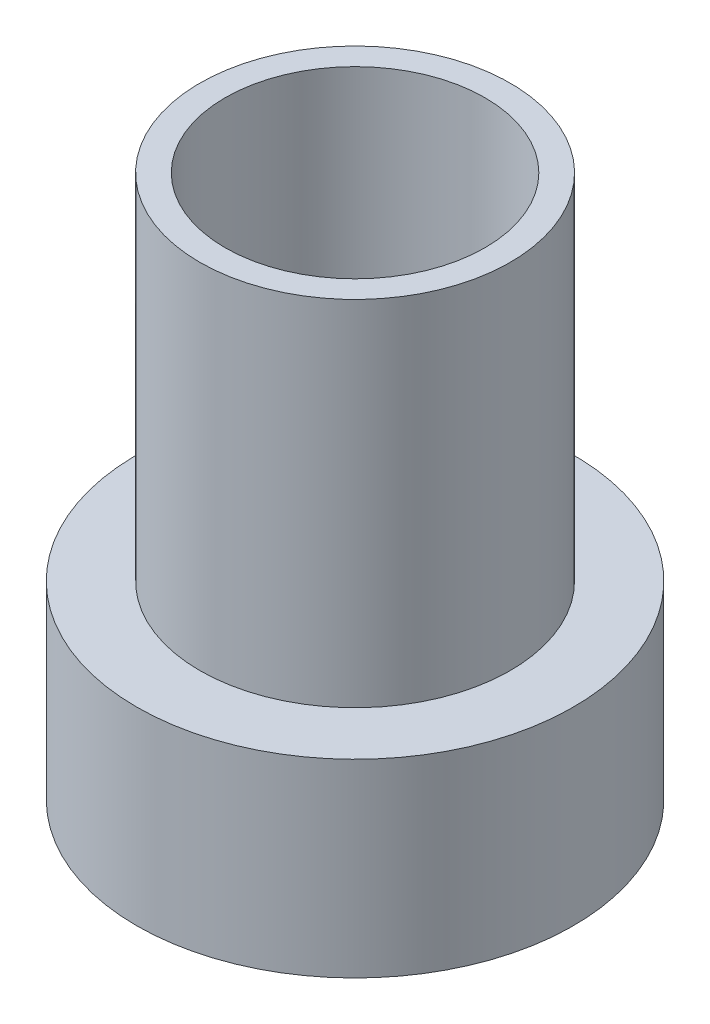
ISO-10303-21;
HEADER;
FILE_DESCRIPTION(('STEP AP214'),'2;1');
FILE_NAME('part.step','',(''),(''),'','','');
FILE_SCHEMA(('AUTOMOTIVE_DESIGN { 1 0 10303 214 1 1 1 1 }'));
ENDSEC;
DATA;
#1=APPLICATION_CONTEXT('core data for automotive mechanical design processes');
#2=APPLICATION_PROTOCOL_DEFINITION('international standard','automotive_design',2000,#1);
#3=PRODUCT_CONTEXT('',#1,'mechanical');
#4=PRODUCT('Part','Part','',(#3));
#5=PRODUCT_RELATED_PRODUCT_CATEGORY('part','',(#4));
#6=PRODUCT_DEFINITION_FORMATION('','',#4);
#7=PRODUCT_DEFINITION_CONTEXT('part definition',#1,'design');
#8=PRODUCT_DEFINITION('design','',#6,#7);
#9=PRODUCT_DEFINITION_SHAPE('','',#8);
#10=(LENGTH_UNIT() NAMED_UNIT(*) SI_UNIT(.MILLI.,.METRE.));
#11=(NAMED_UNIT(*) PLANE_ANGLE_UNIT() SI_UNIT($,.RADIAN.));
#12=(NAMED_UNIT(*) SI_UNIT($,.STERADIAN.) SOLID_ANGLE_UNIT());
#13=UNCERTAINTY_MEASURE_WITH_UNIT(LENGTH_MEASURE(1.E-05),#10,'distance_accuracy_value','');
#14=(GEOMETRIC_REPRESENTATION_CONTEXT(3) GLOBAL_UNCERTAINTY_ASSIGNED_CONTEXT((#13)) GLOBAL_UNIT_ASSIGNED_CONTEXT((#10,
#11,#12)) REPRESENTATION_CONTEXT('',''));
#15=CARTESIAN_POINT('',(0.,0.,0.));
#16=DIRECTION('',(0.,0.,1.));
#17=DIRECTION('',(1.,0.,0.));
#18=AXIS2_PLACEMENT_3D('',#15,#16,#17);
#19=CARTESIAN_POINT('',(0.,3.6,0.));
#20=DIRECTION('',(0.,-1.,0.));
#21=DIRECTION('',(0.,0.,-1.));
#22=AXIS2_PLACEMENT_3D('',#19,#20,#21);
#23=CYLINDRICAL_SURFACE('',#22,4.15);
#24=CARTESIAN_POINT('',(0.,3.6,0.));
#25=DIRECTION('',(0.,1.,0.));
#26=DIRECTION('',(0.,0.,1.));
#27=AXIS2_PLACEMENT_3D('',#24,#25,#26);
#28=CIRCLE('',#27,4.15);
#29=CARTESIAN_POINT('',(0.,3.6,4.15));
#30=VERTEX_POINT('',#29);
#31=EDGE_CURVE('E51',#30,#30,#28,.T.);
#32=ORIENTED_EDGE('',*,*,#31,.F.);
#33=EDGE_LOOP('',(#32));
#34=FACE_BOUND('',#33,.T.);
#35=CARTESIAN_POINT('',(0.,0.,0.));
#36=DIRECTION('',(0.,1.,0.));
#37=DIRECTION('',(0.,0.,1.));
#38=AXIS2_PLACEMENT_3D('',#35,#36,#37);
#39=CIRCLE('',#38,4.15);
#40=CARTESIAN_POINT('',(0.,0.,4.15));
#41=VERTEX_POINT('',#40);
#42=EDGE_CURVE('E58',#41,#41,#39,.T.);
#43=ORIENTED_EDGE('',*,*,#42,.T.);
#44=EDGE_LOOP('',(#43));
#45=FACE_BOUND('',#44,.T.);
#46=ADVANCED_FACE('F39',(#34,#45),#23,.T.);
#47=CARTESIAN_POINT('',(0.,3.6,0.));
#48=DIRECTION('',(0.,1.,0.));
#49=DIRECTION('',(0.,0.,1.));
#50=AXIS2_PLACEMENT_3D('',#47,#48,#49);
#51=PLANE('',#50);
#52=CARTESIAN_POINT('',(0.,3.6,0.));
#53=DIRECTION('',(0.,1.,0.));
#54=DIRECTION('',(0.,0.,1.));
#55=AXIS2_PLACEMENT_3D('',#52,#53,#54);
#56=CIRCLE('',#55,2.95);
#57=CARTESIAN_POINT('',(0.,3.6,2.95));
#58=VERTEX_POINT('',#57);
#59=EDGE_CURVE('E55',#58,#58,#56,.T.);
#60=ORIENTED_EDGE('',*,*,#59,.F.);
#61=EDGE_LOOP('',(#60));
#62=FACE_BOUND('',#61,.T.);
#63=ORIENTED_EDGE('',*,*,#31,.T.);
#64=EDGE_LOOP('',(#63));
#65=FACE_BOUND('',#64,.T.);
#66=ADVANCED_FACE('F89',(#62,#65),#51,.T.);
#67=CARTESIAN_POINT('',(0.,0.,0.));
#68=DIRECTION('',(0.,1.,0.));
#69=DIRECTION('',(0.,0.,1.));
#70=AXIS2_PLACEMENT_3D('',#67,#68,#69);
#71=PLANE('',#70);
#72=CARTESIAN_POINT('',(0.,0.,0.));
#73=DIRECTION('',(0.,1.,0.));
#74=DIRECTION('',(0.,0.,1.));
#75=AXIS2_PLACEMENT_3D('',#72,#73,#74);
#76=CIRCLE('',#75,3.78871958767989);
#77=CARTESIAN_POINT('',(0.,0.,-3.78871958767989));
#78=VERTEX_POINT('',#77);
#79=EDGE_CURVE('E47',#78,#78,#76,.T.);
#80=ORIENTED_EDGE('',*,*,#79,.T.);
#81=EDGE_LOOP('',(#80));
#82=FACE_BOUND('',#81,.T.);
#83=ORIENTED_EDGE('',*,*,#42,.F.);
#84=EDGE_LOOP('',(#83));
#85=FACE_BOUND('',#84,.T.);
#86=ADVANCED_FACE('F86',(#82,#85),#71,.F.);
#87=CARTESIAN_POINT('',(0.,10.32,0.));
#88=DIRECTION('',(0.,-1.,0.));
#89=DIRECTION('',(0.,0.,-1.));
#90=AXIS2_PLACEMENT_3D('',#87,#88,#89);
#91=CYLINDRICAL_SURFACE('',#90,2.47);
#92=CARTESIAN_POINT('',(0.,1.75000000000001,0.));
#93=DIRECTION('',(0.,1.,0.));
#94=DIRECTION('',(0.,0.,1.));
#95=AXIS2_PLACEMENT_3D('',#92,#93,#94);
#96=CIRCLE('',#95,2.47);
#97=CARTESIAN_POINT('',(0.,1.75000000000001,-2.47));
#98=VERTEX_POINT('',#97);
#99=EDGE_CURVE('E10',#98,#98,#96,.F.);
#100=ORIENTED_EDGE('',*,*,#99,.T.);
#101=EDGE_LOOP('',(#100));
#102=FACE_BOUND('',#101,.T.);
#103=CARTESIAN_POINT('',(0.,10.32,0.));
#104=DIRECTION('',(0.,1.,0.));
#105=DIRECTION('',(0.,0.,1.));
#106=AXIS2_PLACEMENT_3D('',#103,#104,#105);
#107=CIRCLE('',#106,2.47);
#108=CARTESIAN_POINT('',(0.,10.32,2.47));
#109=VERTEX_POINT('',#108);
#110=EDGE_CURVE('E66',#109,#109,#107,.T.);
#111=ORIENTED_EDGE('',*,*,#110,.T.);
#112=EDGE_LOOP('',(#111));
#113=FACE_BOUND('',#112,.T.);
#114=ADVANCED_FACE('F70',(#102,#113),#91,.F.);
#115=CARTESIAN_POINT('',(0.,10.32,0.));
#116=DIRECTION('',(0.,-1.,0.));
#117=DIRECTION('',(0.,0.,-1.));
#118=AXIS2_PLACEMENT_3D('',#115,#116,#117);
#119=CYLINDRICAL_SURFACE('',#118,2.95);
#120=ORIENTED_EDGE('',*,*,#59,.T.);
#121=EDGE_LOOP('',(#120));
#122=FACE_BOUND('',#121,.T.);
#123=CARTESIAN_POINT('',(0.,10.32,0.));
#124=DIRECTION('',(0.,1.,0.));
#125=DIRECTION('',(0.,0.,1.));
#126=AXIS2_PLACEMENT_3D('',#123,#124,#125);
#127=CIRCLE('',#126,2.95);
#128=CARTESIAN_POINT('',(0.,10.32,2.95));
#129=VERTEX_POINT('',#128);
#130=EDGE_CURVE('E60',#129,#129,#127,.T.);
#131=ORIENTED_EDGE('',*,*,#130,.F.);
#132=EDGE_LOOP('',(#131));
#133=FACE_BOUND('',#132,.T.);
#134=ADVANCED_FACE('F75',(#122,#133),#119,.T.);
#135=CARTESIAN_POINT('',(0.,10.32,0.));
#136=DIRECTION('',(0.,1.,0.));
#137=DIRECTION('',(0.,0.,1.));
#138=AXIS2_PLACEMENT_3D('',#135,#136,#137);
#139=PLANE('',#138);
#140=ORIENTED_EDGE('',*,*,#110,.F.);
#141=EDGE_LOOP('',(#140));
#142=FACE_BOUND('',#141,.T.);
#143=ORIENTED_EDGE('',*,*,#130,.T.);
#144=EDGE_LOOP('',(#143));
#145=FACE_BOUND('',#144,.T.);
#146=ADVANCED_FACE('F72',(#142,#145),#139,.T.);
#147=CARTESIAN_POINT('',(0.,0.,0.));
#148=DIRECTION('',(0.,-1.,0.));
#149=DIRECTION('',(0.,0.,-1.));
#150=AXIS2_PLACEMENT_3D('',#147,#148,#149);
#151=CONICAL_SURFACE('',#150,3.78871958767989,0.6457718232379);
#152=CARTESIAN_POINT('',(0.,1.75000000000001,-2.47));
#153=CARTESIAN_POINT('',(0.,1.73177083333334,-2.48373666237167));
#154=CARTESIAN_POINT('',(0.,1.71354166666667,-2.49747332474333));
#155=CARTESIAN_POINT('',(0.,1.67708333333334,-2.52494664948666));
#156=CARTESIAN_POINT('',(0.,1.65885416666667,-2.53868331185833));
#157=CARTESIAN_POINT('',(0.,1.62239583333334,-2.56615663660166));
#158=CARTESIAN_POINT('',(0.,1.60416666666667,-2.57989329897332));
#159=CARTESIAN_POINT('',(0.,1.56770833333334,-2.60736662371666));
#160=CARTESIAN_POINT('',(0.,1.54947916666667,-2.62110328608832));
#161=CARTESIAN_POINT('',(0.,1.51302083333334,-2.64857661083165));
#162=CARTESIAN_POINT('',(0.,1.49479166666667,-2.66231327320332));
#163=CARTESIAN_POINT('',(0.,1.45833333333334,-2.68978659794665));
#164=CARTESIAN_POINT('',(0.,1.44010416666667,-2.70352326031831));
#165=CARTESIAN_POINT('',(0.,1.40364583333334,-2.73099658506165));
#166=CARTESIAN_POINT('',(0.,1.38541666666667,-2.74473324743331));
#167=CARTESIAN_POINT('',(0.,1.34895833333334,-2.77220657217664));
#168=CARTESIAN_POINT('',(0.,1.33072916666667,-2.78594323454831));
#169=CARTESIAN_POINT('',(0.,1.29427083333334,-2.81341655929164));
#170=CARTESIAN_POINT('',(0.,1.27604166666667,-2.8271532216633));
#171=CARTESIAN_POINT('',(0.,1.23958333333334,-2.85462654640664));
#172=CARTESIAN_POINT('',(0.,1.22135416666667,-2.8683632087783));
#173=CARTESIAN_POINT('',(0.,1.18489583333334,-2.89583653352163));
#174=CARTESIAN_POINT('',(0.,1.16666666666667,-2.9095731958933));
#175=CARTESIAN_POINT('',(0.,1.13020833333334,-2.93704652063663));
#176=CARTESIAN_POINT('',(0.,1.11197916666667,-2.95078318300829));
#177=CARTESIAN_POINT('',(0.,1.07552083333334,-2.97825650775162));
#178=CARTESIAN_POINT('',(0.,1.05729166666667,-2.99199317012329));
#179=CARTESIAN_POINT('',(0.,1.02083333333334,-3.01946649486662));
#180=CARTESIAN_POINT('',(0.,1.00260416666667,-3.03320315723829));
#181=CARTESIAN_POINT('',(0.,0.966145833333337,-3.06067648198162));
#182=CARTESIAN_POINT('',(0.,0.94791666666667,-3.07441314435328));
#183=CARTESIAN_POINT('',(0.,0.911458333333337,-3.10188646909661));
#184=CARTESIAN_POINT('',(0.,0.89322916666667,-3.11562313146828));
#185=CARTESIAN_POINT('',(0.,0.856770833333336,-3.14309645621161));
#186=CARTESIAN_POINT('',(0.,0.83854166666667,-3.15683311858328));
#187=CARTESIAN_POINT('',(0.,0.802083333333336,-3.18430644332661));
#188=CARTESIAN_POINT('',(0.,0.783854166666669,-3.19804310569827));
#189=CARTESIAN_POINT('',(0.,0.747395833333336,-3.2255164304416));
#190=CARTESIAN_POINT('',(0.,0.729166666666669,-3.23925309281327));
#191=CARTESIAN_POINT('',(0.,0.692708333333336,-3.2667264175566));
#192=CARTESIAN_POINT('',(0.,0.674479166666669,-3.28046307992827));
#193=CARTESIAN_POINT('',(0.,0.638020833333336,-3.3079364046716));
#194=CARTESIAN_POINT('',(0.,0.619791666666669,-3.32167306704326));
#195=CARTESIAN_POINT('',(0.,0.583333333333336,-3.34914639178659));
#196=CARTESIAN_POINT('',(0.,0.565104166666669,-3.36288305415826));
#197=CARTESIAN_POINT('',(0.,0.528645833333335,-3.39035637890159));
#198=CARTESIAN_POINT('',(0.,0.510416666666669,-3.40409304127326));
#199=CARTESIAN_POINT('',(0.,0.473958333333335,-3.43156636601659));
#200=CARTESIAN_POINT('',(0.,0.455729166666668,-3.44530302838825));
#201=CARTESIAN_POINT('',(0.,0.419270833333335,-3.47277635313158));
#202=CARTESIAN_POINT('',(0.,0.401041666666668,-3.48651301550325));
#203=CARTESIAN_POINT('',(0.,0.364583333333335,-3.51398634024658));
#204=CARTESIAN_POINT('',(0.,0.346354166666668,-3.52772300261825));
#205=CARTESIAN_POINT('',(0.,0.309895833333334,-3.55519632736158));
#206=CARTESIAN_POINT('',(0.,0.291666666666668,-3.56893298973324));
#207=CARTESIAN_POINT('',(0.,0.255208333333334,-3.59640631447657));
#208=CARTESIAN_POINT('',(0.,0.236979166666668,-3.61014297684824));
#209=CARTESIAN_POINT('',(0.,0.200520833333334,-3.63761630159157));
#210=CARTESIAN_POINT('',(0.,0.182291666666667,-3.65135296396323));
#211=CARTESIAN_POINT('',(0.,0.145833333333334,-3.67882628870657));
#212=CARTESIAN_POINT('',(0.,0.127604166666667,-3.69256295107823));
#213=CARTESIAN_POINT('',(0.,0.0911458333333338,-3.72003627582156));
#214=CARTESIAN_POINT('',(0.,0.072916666666667,-3.73377293819323));
#215=CARTESIAN_POINT('',(0.,0.0364583333333336,-3.76124626293656));
#216=CARTESIAN_POINT('',(0.,0.0182291666666669,-3.77498292530823));
#217=CARTESIAN_POINT('',(0.,0.,-3.78871958767989));
#218=B_SPLINE_CURVE_WITH_KNOTS('',3,(#152,#153,#154,#155,#156,#157,#158,#159,#160,#161,#162,
#163,#164,#165,#166,#167,#168,#169,#170,#171,#172,#173,#174,#175,#176,#177,#178,#179,#180,#181,
#182,#183,#184,#185,#186,#187,#188,#189,#190,#191,#192,#193,#194,#195,#196,#197,#198,#199,#200,
#201,#202,#203,#204,#205,#206,#207,#208,#209,#210,#211,#212,#213,#214,#215,#216,#217),
.UNSPECIFIED.,.F.,.F.,(4,2,2,2,2,2,2,2,2,2,2,2,2,2,2,2,2,2,2,2,2,2,2,2,2,2,2,2,2,2,2,2,4),(0.,
0.0684761688054187,0.136952337610838,0.205428506416256,0.273904675221675,0.342380844027094,
0.410857012832512,0.479333181637931,0.54780935044335,0.616285519248769,0.684761688054188,
0.753237856859606,0.821714025665025,0.890190194470444,0.958666363275863,1.02714253208128,
1.0956187008867,1.16409486969212,1.23257103849754,1.30104720730296,1.36952337610838,
1.43799954491379,1.50647571371921,1.57495188252463,1.64342805133005,1.71190422013547,
1.78038038894089,1.84885655774631,1.91733272655173,1.98580889535714,2.05428506416256,
2.12276123296798,2.1912374017734),.UNSPECIFIED.);
#219=EDGE_CURVE('BSEAM42',#98,#78,#218,.T.);
#220=ORIENTED_EDGE('',*,*,#99,.F.);
#221=ORIENTED_EDGE('',*,*,#79,.F.);
#222=ORIENTED_EDGE('',*,*,#219,.T.);
#223=ORIENTED_EDGE('',*,*,#219,.F.);
#224=EDGE_LOOP('',(#220,#222,#221,#223));
#225=FACE_BOUND('',#224,.T.);
#226=ADVANCED_FACE('F42',(#225),#151,.F.);
#227=CLOSED_SHELL('',(#46,#66,#86,#114,#134,#146,#226));
#228=MANIFOLD_SOLID_BREP('B2',#227);
#229=ADVANCED_BREP_SHAPE_REPRESENTATION('',(#18,#228),#14);
#230=SHAPE_DEFINITION_REPRESENTATION(#9,#229);
ENDSEC;
END-ISO-10303-21;
